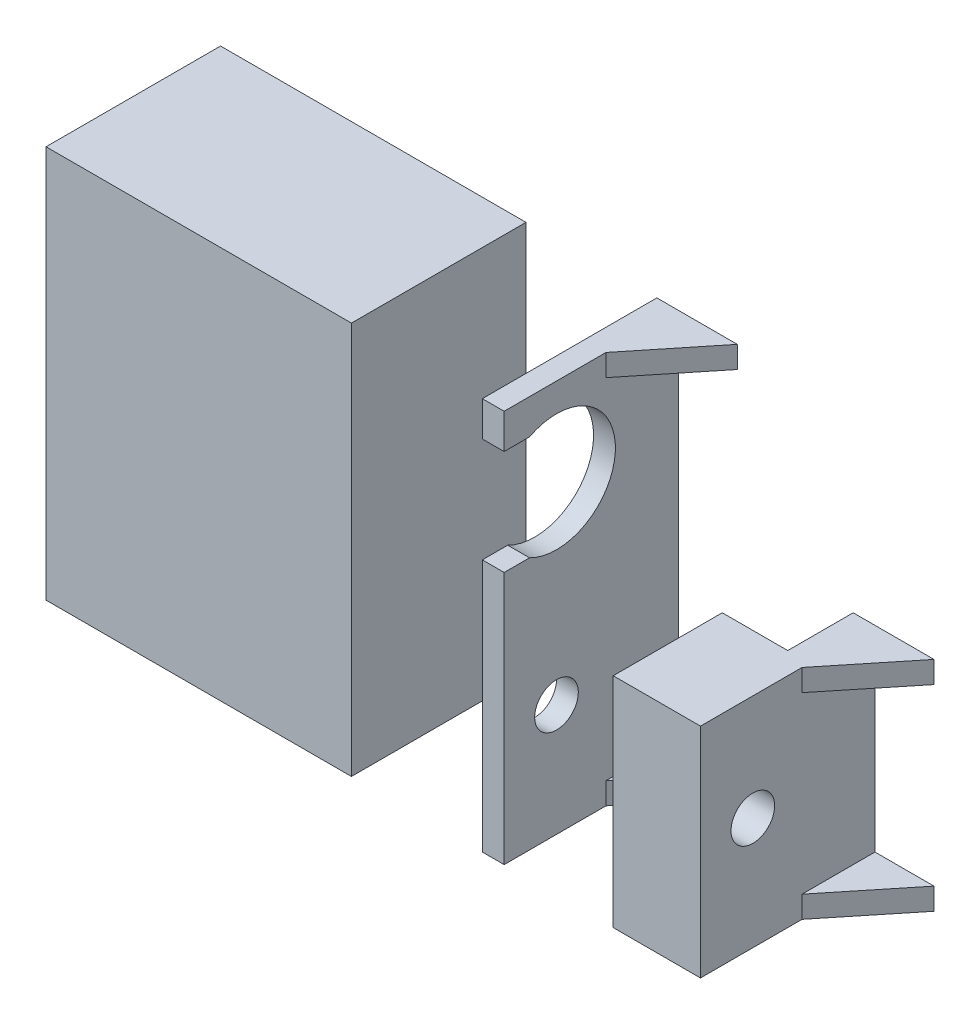
ISO-10303-21;
HEADER;
FILE_DESCRIPTION(('STEP AP214'),'2;1');
FILE_NAME('part.step','',(''),(''),'','','');
FILE_SCHEMA(('AUTOMOTIVE_DESIGN { 1 0 10303 214 1 1 1 1 }'));
ENDSEC;
DATA;
#1=APPLICATION_CONTEXT('core data for automotive mechanical design processes');
#2=APPLICATION_PROTOCOL_DEFINITION('international standard','automotive_design',2000,#1);
#3=PRODUCT_CONTEXT('',#1,'mechanical');
#4=PRODUCT('Part','Part','',(#3));
#5=PRODUCT_RELATED_PRODUCT_CATEGORY('part','',(#4));
#6=PRODUCT_DEFINITION_FORMATION('','',#4);
#7=PRODUCT_DEFINITION_CONTEXT('part definition',#1,'design');
#8=PRODUCT_DEFINITION('design','',#6,#7);
#9=PRODUCT_DEFINITION_SHAPE('','',#8);
#10=(LENGTH_UNIT() NAMED_UNIT(*) SI_UNIT(.MILLI.,.METRE.));
#11=(NAMED_UNIT(*) PLANE_ANGLE_UNIT() SI_UNIT($,.RADIAN.));
#12=(NAMED_UNIT(*) SI_UNIT($,.STERADIAN.) SOLID_ANGLE_UNIT());
#13=UNCERTAINTY_MEASURE_WITH_UNIT(LENGTH_MEASURE(1.E-05),#10,'distance_accuracy_value','');
#14=(GEOMETRIC_REPRESENTATION_CONTEXT(3) GLOBAL_UNCERTAINTY_ASSIGNED_CONTEXT((#13)) GLOBAL_UNIT_ASSIGNED_CONTEXT((#10,
#11,#12)) REPRESENTATION_CONTEXT('',''));
#15=CARTESIAN_POINT('',(0.,0.,0.));
#16=DIRECTION('',(0.,0.,1.));
#17=DIRECTION('',(1.,0.,0.));
#18=AXIS2_PLACEMENT_3D('',#15,#16,#17);
#19=CARTESIAN_POINT('',(-200.,20.,5.));
#20=DIRECTION('',(0.,0.,1.));
#21=DIRECTION('',(1.,0.,0.));
#22=AXIS2_PLACEMENT_3D('',#19,#20,#21);
#23=PLANE('',#22);
#24=DIRECTION('',(0.,-1.,0.));
#25=VECTOR('',#24,1.);
#26=CARTESIAN_POINT('',(-130.,20.,5.));
#27=LINE('',#26,#25);
#28=CARTESIAN_POINT('',(-130.,20.,5.));
#29=VERTEX_POINT('',#28);
#30=CARTESIAN_POINT('',(-130.,-70.,5.));
#31=VERTEX_POINT('',#30);
#32=EDGE_CURVE('E110',#29,#31,#27,.T.);
#33=ORIENTED_EDGE('',*,*,#32,.T.);
#34=DIRECTION('',(1.,0.,0.));
#35=VECTOR('',#34,1.);
#36=CARTESIAN_POINT('',(-200.,-70.,5.));
#37=LINE('',#36,#35);
#38=CARTESIAN_POINT('',(-200.,-70.,5.));
#39=VERTEX_POINT('',#38);
#40=EDGE_CURVE('E12',#39,#31,#37,.T.);
#41=ORIENTED_EDGE('',*,*,#40,.F.);
#42=DIRECTION('',(0.,-1.,0.));
#43=VECTOR('',#42,1.);
#44=CARTESIAN_POINT('',(-200.,20.,5.));
#45=LINE('',#44,#43);
#46=CARTESIAN_POINT('',(-200.,20.,5.));
#47=VERTEX_POINT('',#46);
#48=EDGE_CURVE('E98',#47,#39,#45,.T.);
#49=ORIENTED_EDGE('',*,*,#48,.F.);
#50=DIRECTION('',(1.,0.,0.));
#51=VECTOR('',#50,1.);
#52=CARTESIAN_POINT('',(-200.,20.,5.));
#53=LINE('',#52,#51);
#54=EDGE_CURVE('E106',#47,#29,#53,.T.);
#55=ORIENTED_EDGE('',*,*,#54,.T.);
#56=EDGE_LOOP('',(#33,#41,#49,#55));
#57=FACE_BOUND('',#56,.T.);
#58=ADVANCED_FACE('F47',(#57),#23,.F.);
#59=CARTESIAN_POINT('',(-200.,-70.,5.));
#60=DIRECTION('',(0.,1.,0.));
#61=DIRECTION('',(-1.,0.,0.));
#62=AXIS2_PLACEMENT_3D('',#59,#60,#61);
#63=PLANE('',#62);
#64=DIRECTION('',(0.,0.,1.));
#65=VECTOR('',#64,1.);
#66=CARTESIAN_POINT('',(-130.,-70.,5.));
#67=LINE('',#66,#65);
#68=CARTESIAN_POINT('',(-130.,-70.,45.));
#69=VERTEX_POINT('',#68);
#70=EDGE_CURVE('E102',#31,#69,#67,.T.);
#71=ORIENTED_EDGE('',*,*,#70,.T.);
#72=DIRECTION('',(1.,0.,0.));
#73=VECTOR('',#72,1.);
#74=CARTESIAN_POINT('',(-200.,-70.,45.));
#75=LINE('',#74,#73);
#76=CARTESIAN_POINT('',(-200.,-70.,45.));
#77=VERTEX_POINT('',#76);
#78=EDGE_CURVE('E55',#77,#69,#75,.T.);
#79=ORIENTED_EDGE('',*,*,#78,.F.);
#80=DIRECTION('',(0.,0.,1.));
#81=VECTOR('',#80,1.);
#82=CARTESIAN_POINT('',(-200.,-70.,5.));
#83=LINE('',#82,#81);
#84=EDGE_CURVE('E93',#39,#77,#83,.T.);
#85=ORIENTED_EDGE('',*,*,#84,.F.);
#86=ORIENTED_EDGE('',*,*,#40,.T.);
#87=EDGE_LOOP('',(#71,#79,#85,#86));
#88=FACE_BOUND('',#87,.T.);
#89=ADVANCED_FACE('F101',(#88),#63,.F.);
#90=CARTESIAN_POINT('',(-200.,20.,45.));
#91=DIRECTION('',(0.,0.,-1.));
#92=DIRECTION('',(0.,1.,0.));
#93=AXIS2_PLACEMENT_3D('',#90,#91,#92);
#94=PLANE('',#93);
#95=DIRECTION('',(0.,1.,0.));
#96=VECTOR('',#95,1.);
#97=CARTESIAN_POINT('',(-130.,20.,45.));
#98=LINE('',#97,#96);
#99=CARTESIAN_POINT('',(-130.,20.,45.));
#100=VERTEX_POINT('',#99);
#101=EDGE_CURVE('E80',#69,#100,#98,.T.);
#102=ORIENTED_EDGE('',*,*,#101,.T.);
#103=DIRECTION('',(1.,0.,0.));
#104=VECTOR('',#103,1.);
#105=CARTESIAN_POINT('',(-200.,20.,45.));
#106=LINE('',#105,#104);
#107=CARTESIAN_POINT('',(-200.,20.,45.));
#108=VERTEX_POINT('',#107);
#109=EDGE_CURVE('E103',#108,#100,#106,.T.);
#110=ORIENTED_EDGE('',*,*,#109,.F.);
#111=DIRECTION('',(0.,1.,0.));
#112=VECTOR('',#111,1.);
#113=CARTESIAN_POINT('',(-200.,20.,45.));
#114=LINE('',#113,#112);
#115=EDGE_CURVE('E96',#77,#108,#114,.T.);
#116=ORIENTED_EDGE('',*,*,#115,.F.);
#117=ORIENTED_EDGE('',*,*,#78,.T.);
#118=EDGE_LOOP('',(#102,#110,#116,#117));
#119=FACE_BOUND('',#118,.T.);
#120=ADVANCED_FACE('F104',(#119),#94,.F.);
#121=CARTESIAN_POINT('',(-200.,20.,5.));
#122=DIRECTION('',(0.,-1.,0.));
#123=DIRECTION('',(1.,0.,0.));
#124=AXIS2_PLACEMENT_3D('',#121,#122,#123);
#125=PLANE('',#124);
#126=DIRECTION('',(0.,0.,-1.));
#127=VECTOR('',#126,1.);
#128=CARTESIAN_POINT('',(-130.,20.,5.));
#129=LINE('',#128,#127);
#130=EDGE_CURVE('E86',#100,#29,#129,.T.);
#131=ORIENTED_EDGE('',*,*,#130,.T.);
#132=ORIENTED_EDGE('',*,*,#54,.F.);
#133=DIRECTION('',(0.,0.,-1.));
#134=VECTOR('',#133,1.);
#135=CARTESIAN_POINT('',(-200.,20.,5.));
#136=LINE('',#135,#134);
#137=EDGE_CURVE('E63',#108,#47,#136,.T.);
#138=ORIENTED_EDGE('',*,*,#137,.F.);
#139=ORIENTED_EDGE('',*,*,#109,.T.);
#140=EDGE_LOOP('',(#131,#132,#138,#139));
#141=FACE_BOUND('',#140,.T.);
#142=ADVANCED_FACE('F117',(#141),#125,.F.);
#143=CARTESIAN_POINT('',(-200.,0.,0.));
#144=DIRECTION('',(-1.,0.,0.));
#145=DIRECTION('',(0.,-1.,0.));
#146=AXIS2_PLACEMENT_3D('',#143,#144,#145);
#147=PLANE('',#146);
#148=ORIENTED_EDGE('',*,*,#48,.T.);
#149=ORIENTED_EDGE('',*,*,#84,.T.);
#150=ORIENTED_EDGE('',*,*,#115,.T.);
#151=ORIENTED_EDGE('',*,*,#137,.T.);
#152=EDGE_LOOP('',(#148,#149,#150,#151));
#153=FACE_BOUND('',#152,.T.);
#154=ADVANCED_FACE('F94',(#153),#147,.T.);
#155=CARTESIAN_POINT('',(-130.,0.,0.));
#156=DIRECTION('',(-1.,0.,0.));
#157=DIRECTION('',(0.,-1.,0.));
#158=AXIS2_PLACEMENT_3D('',#155,#156,#157);
#159=PLANE('',#158);
#160=ORIENTED_EDGE('',*,*,#32,.F.);
#161=ORIENTED_EDGE('',*,*,#130,.F.);
#162=ORIENTED_EDGE('',*,*,#101,.F.);
#163=ORIENTED_EDGE('',*,*,#70,.F.);
#164=EDGE_LOOP('',(#160,#161,#162,#163));
#165=FACE_BOUND('',#164,.T.);
#166=ADVANCED_FACE('F120',(#165),#159,.F.);
#167=CLOSED_SHELL('',(#58,#89,#120,#142,#154,#166));
#168=MANIFOLD_SOLID_BREP('B2',#167);
#169=CARTESIAN_POINT('',(-95.,20.,45.));
#170=DIRECTION('',(1.,0.,0.));
#171=DIRECTION('',(0.,0.,-1.));
#172=AXIS2_PLACEMENT_3D('',#169,#170,#171);
#173=PLANE('',#172);
#174=CARTESIAN_POINT('',(-95.,0.,33.));
#175=DIRECTION('',(1.,0.,0.));
#176=DIRECTION('',(0.,0.,-1.));
#177=AXIS2_PLACEMENT_3D('',#174,#175,#176);
#178=CIRCLE('',#177,13.5);
#179=CARTESIAN_POINT('',(-95.,-12.,39.1846584384265));
#180=VERTEX_POINT('',#179);
#181=CARTESIAN_POINT('',(-95.,12.,39.1846584384265));
#182=VERTEX_POINT('',#181);
#183=EDGE_CURVE('E283',#180,#182,#178,.T.);
#184=ORIENTED_EDGE('',*,*,#183,.F.);
#185=DIRECTION('',(0.,0.,-1.));
#186=VECTOR('',#185,1.);
#187=CARTESIAN_POINT('',(-95.,-12.,45.));
#188=LINE('',#187,#186);
#189=CARTESIAN_POINT('',(-95.,-12.,45.));
#190=VERTEX_POINT('',#189);
#191=EDGE_CURVE('E305',#190,#180,#188,.T.);
#192=ORIENTED_EDGE('',*,*,#191,.F.);
#193=DIRECTION('',(0.,-1.,0.));
#194=VECTOR('',#193,1.);
#195=CARTESIAN_POINT('',(-95.,-20.,45.));
#196=LINE('',#195,#194);
#197=CARTESIAN_POINT('',(-95.,-70.,45.));
#198=VERTEX_POINT('',#197);
#199=EDGE_CURVE('E390',#190,#198,#196,.T.);
#200=ORIENTED_EDGE('',*,*,#199,.T.);
#201=DIRECTION('',(0.,0.,-1.));
#202=VECTOR('',#201,1.);
#203=CARTESIAN_POINT('',(-95.,-70.,45.));
#204=LINE('',#203,#202);
#205=CARTESIAN_POINT('',(-95.,-70.,21.6603892199681));
#206=VERTEX_POINT('',#205);
#207=EDGE_CURVE('E271',#198,#206,#204,.T.);
#208=ORIENTED_EDGE('',*,*,#207,.T.);
#209=DIRECTION('',(0.,-1.,0.));
#210=VECTOR('',#209,1.);
#211=CARTESIAN_POINT('',(-95.,-65.,21.6603892199681));
#212=LINE('',#211,#210);
#213=CARTESIAN_POINT('',(-95.,-65.,21.6603892199681));
#214=VERTEX_POINT('',#213);
#215=EDGE_CURVE('E252',#214,#206,#212,.T.);
#216=ORIENTED_EDGE('',*,*,#215,.F.);
#217=DIRECTION('',(0.,0.,1.));
#218=VECTOR('',#217,1.);
#219=CARTESIAN_POINT('',(-95.,-65.,5.));
#220=LINE('',#219,#218);
#221=CARTESIAN_POINT('',(-95.,-65.,5.));
#222=VERTEX_POINT('',#221);
#223=EDGE_CURVE('E246',#222,#214,#220,.T.);
#224=ORIENTED_EDGE('',*,*,#223,.F.);
#225=DIRECTION('',(0.,-1.,0.));
#226=VECTOR('',#225,1.);
#227=CARTESIAN_POINT('',(-95.,20.,5.));
#228=LINE('',#227,#226);
#229=CARTESIAN_POINT('',(-95.,15.,5.));
#230=VERTEX_POINT('',#229);
#231=EDGE_CURVE('E189',#230,#222,#228,.T.);
#232=ORIENTED_EDGE('',*,*,#231,.F.);
#233=DIRECTION('',(0.,0.,-1.));
#234=VECTOR('',#233,1.);
#235=CARTESIAN_POINT('',(-95.,15.,21.6603892199681));
#236=LINE('',#235,#234);
#237=CARTESIAN_POINT('',(-95.,15.,21.6603892199681));
#238=VERTEX_POINT('',#237);
#239=EDGE_CURVE('E273',#238,#230,#236,.T.);
#240=ORIENTED_EDGE('',*,*,#239,.F.);
#241=DIRECTION('',(0.,1.,0.));
#242=VECTOR('',#241,1.);
#243=CARTESIAN_POINT('',(-95.,15.,21.6603892199681));
#244=LINE('',#243,#242);
#245=CARTESIAN_POINT('',(-95.,20.,21.6603892199681));
#246=VERTEX_POINT('',#245);
#247=EDGE_CURVE('E268',#238,#246,#244,.T.);
#248=ORIENTED_EDGE('',*,*,#247,.T.);
#249=DIRECTION('',(0.,0.,-1.));
#250=VECTOR('',#249,1.);
#251=CARTESIAN_POINT('',(-95.,20.,45.));
#252=LINE('',#251,#250);
#253=CARTESIAN_POINT('',(-95.,20.,45.));
#254=VERTEX_POINT('',#253);
#255=EDGE_CURVE('E371',#254,#246,#252,.T.);
#256=ORIENTED_EDGE('',*,*,#255,.F.);
#257=CARTESIAN_POINT('',(-95.,12.,45.));
#258=VERTEX_POINT('',#257);
#259=EDGE_CURVE('E270',#254,#258,#196,.T.);
#260=ORIENTED_EDGE('',*,*,#259,.T.);
#261=DIRECTION('',(0.,0.,1.));
#262=VECTOR('',#261,1.);
#263=CARTESIAN_POINT('',(-95.,12.,45.));
#264=LINE('',#263,#262);
#265=EDGE_CURVE('E281',#182,#258,#264,.T.);
#266=ORIENTED_EDGE('',*,*,#265,.F.);
#267=EDGE_LOOP('',(#184,#192,#200,#208,#216,#224,#232,#240,#248,#256,#260,#266));
#268=FACE_BOUND('',#267,.T.);
#269=CARTESIAN_POINT('',(-95.,-44.2798645583245,32.9999999999999));
#270=DIRECTION('',(1.,0.,0.));
#271=DIRECTION('',(0.,0.,-1.));
#272=AXIS2_PLACEMENT_3D('',#269,#270,#271);
#273=CIRCLE('',#272,5.);
#274=CARTESIAN_POINT('',(-95.,-44.2798645583245,27.9999999999999));
#275=VERTEX_POINT('',#274);
#276=EDGE_CURVE('E325',#275,#275,#273,.T.);
#277=ORIENTED_EDGE('',*,*,#276,.F.);
#278=EDGE_LOOP('',(#277));
#279=FACE_BOUND('',#278,.T.);
#280=ADVANCED_FACE('F179',(#268,#279),#173,.T.);
#281=CARTESIAN_POINT('',(0.,0.,45.));
#282=DIRECTION('',(0.,0.,1.));
#283=DIRECTION('',(1.,0.,0.));
#284=AXIS2_PLACEMENT_3D('',#281,#282,#283);
#285=PLANE('',#284);
#286=DIRECTION('',(1.,0.,0.));
#287=VECTOR('',#286,1.);
#288=CARTESIAN_POINT('',(-176.,12.,45.));
#289=LINE('',#288,#287);
#290=CARTESIAN_POINT('',(-100.,12.,45.));
#291=VERTEX_POINT('',#290);
#292=EDGE_CURVE('E326',#291,#258,#289,.T.);
#293=ORIENTED_EDGE('',*,*,#292,.T.);
#294=ORIENTED_EDGE('',*,*,#259,.F.);
#295=DIRECTION('',(1.,0.,0.));
#296=VECTOR('',#295,1.);
#297=CARTESIAN_POINT('',(-100.,20.,45.));
#298=LINE('',#297,#296);
#299=CARTESIAN_POINT('',(-100.,20.,45.));
#300=VERTEX_POINT('',#299);
#301=EDGE_CURVE('E376',#300,#254,#298,.T.);
#302=ORIENTED_EDGE('',*,*,#301,.F.);
#303=DIRECTION('',(0.,-1.,0.));
#304=VECTOR('',#303,1.);
#305=CARTESIAN_POINT('',(-100.,20.,45.));
#306=LINE('',#305,#304);
#307=EDGE_CURVE('E319',#300,#291,#306,.T.);
#308=ORIENTED_EDGE('',*,*,#307,.T.);
#309=EDGE_LOOP('',(#293,#294,#302,#308));
#310=FACE_BOUND('',#309,.T.);
#311=ADVANCED_FACE('F395',(#310),#285,.T.);
#312=CARTESIAN_POINT('',(-100.,-20.,45.));
#313=DIRECTION('',(1.,0.,0.));
#314=DIRECTION('',(0.,1.,0.));
#315=AXIS2_PLACEMENT_3D('',#312,#313,#314);
#316=PLANE('',#315);
#317=CARTESIAN_POINT('',(-100.,-44.2798645583245,32.9999999999999));
#318=DIRECTION('',(1.,0.,0.));
#319=DIRECTION('',(0.,1.,0.));
#320=AXIS2_PLACEMENT_3D('',#317,#318,#319);
#321=CIRCLE('',#320,5.);
#322=CARTESIAN_POINT('',(-100.,-39.2798645583245,32.9999999999999));
#323=VERTEX_POINT('',#322);
#324=EDGE_CURVE('E314',#323,#323,#321,.T.);
#325=ORIENTED_EDGE('',*,*,#324,.T.);
#326=EDGE_LOOP('',(#325));
#327=FACE_BOUND('',#326,.T.);
#328=DIRECTION('',(0.,0.,-1.));
#329=VECTOR('',#328,1.);
#330=CARTESIAN_POINT('',(-100.,-12.,45.));
#331=LINE('',#330,#329);
#332=CARTESIAN_POINT('',(-100.,-12.,45.));
#333=VERTEX_POINT('',#332);
#334=CARTESIAN_POINT('',(-100.,-12.,39.1846584384265));
#335=VERTEX_POINT('',#334);
#336=EDGE_CURVE('E302',#333,#335,#331,.T.);
#337=ORIENTED_EDGE('',*,*,#336,.T.);
#338=CARTESIAN_POINT('',(-100.,0.,33.));
#339=DIRECTION('',(-1.,0.,0.));
#340=DIRECTION('',(0.,-1.,0.));
#341=AXIS2_PLACEMENT_3D('',#338,#339,#340);
#342=CIRCLE('',#341,13.5);
#343=CARTESIAN_POINT('',(-100.,12.,39.1846584384265));
#344=VERTEX_POINT('',#343);
#345=EDGE_CURVE('E183',#344,#335,#342,.T.);
#346=ORIENTED_EDGE('',*,*,#345,.F.);
#347=DIRECTION('',(0.,0.,1.));
#348=VECTOR('',#347,1.);
#349=CARTESIAN_POINT('',(-100.,12.,45.));
#350=LINE('',#349,#348);
#351=EDGE_CURVE('E313',#344,#291,#350,.T.);
#352=ORIENTED_EDGE('',*,*,#351,.T.);
#353=ORIENTED_EDGE('',*,*,#307,.F.);
#354=DIRECTION('',(0.,0.,-1.));
#355=VECTOR('',#354,1.);
#356=CARTESIAN_POINT('',(-100.,20.,45.));
#357=LINE('',#356,#355);
#358=CARTESIAN_POINT('',(-100.,20.,5.));
#359=VERTEX_POINT('',#358);
#360=EDGE_CURVE('E316',#300,#359,#357,.T.);
#361=ORIENTED_EDGE('',*,*,#360,.T.);
#362=DIRECTION('',(0.,-1.,0.));
#363=VECTOR('',#362,1.);
#364=CARTESIAN_POINT('',(-100.,-20.,5.));
#365=LINE('',#364,#363);
#366=CARTESIAN_POINT('',(-100.,-70.,5.));
#367=VERTEX_POINT('',#366);
#368=EDGE_CURVE('E385',#359,#367,#365,.T.);
#369=ORIENTED_EDGE('',*,*,#368,.T.);
#370=DIRECTION('',(0.,0.,-1.));
#371=VECTOR('',#370,1.);
#372=CARTESIAN_POINT('',(-100.,-70.,45.));
#373=LINE('',#372,#371);
#374=CARTESIAN_POINT('',(-100.,-70.,45.));
#375=VERTEX_POINT('',#374);
#376=EDGE_CURVE('E379',#375,#367,#373,.T.);
#377=ORIENTED_EDGE('',*,*,#376,.F.);
#378=EDGE_CURVE('E312',#333,#375,#306,.T.);
#379=ORIENTED_EDGE('',*,*,#378,.F.);
#380=EDGE_LOOP('',(#337,#346,#352,#353,#361,#369,#377,#379));
#381=FACE_BOUND('',#380,.T.);
#382=ADVANCED_FACE('F309',(#327,#381),#316,.F.);
#383=CARTESIAN_POINT('',(-100.,-70.,45.));
#384=DIRECTION('',(0.,1.,0.));
#385=DIRECTION('',(0.,0.,1.));
#386=AXIS2_PLACEMENT_3D('',#383,#384,#385);
#387=PLANE('',#386);
#388=DIRECTION('',(1.,0.,0.));
#389=VECTOR('',#388,1.);
#390=CARTESIAN_POINT('',(-100.,-70.,5.));
#391=LINE('',#390,#389);
#392=CARTESIAN_POINT('',(-81.5668094011145,-70.,5.));
#393=VERTEX_POINT('',#392);
#394=EDGE_CURVE('E197',#367,#393,#391,.T.);
#395=ORIENTED_EDGE('',*,*,#394,.T.);
#396=DIRECTION('',(0.627678633147685,0.,-0.778472564378382));
#397=VECTOR('',#396,1.);
#398=CARTESIAN_POINT('',(-95.,-70.,21.6603892199681));
#399=LINE('',#398,#397);
#400=EDGE_CURVE('E265',#206,#393,#399,.T.);
#401=ORIENTED_EDGE('',*,*,#400,.F.);
#402=ORIENTED_EDGE('',*,*,#207,.F.);
#403=DIRECTION('',(1.,0.,0.));
#404=VECTOR('',#403,1.);
#405=CARTESIAN_POINT('',(-100.,-70.,45.));
#406=LINE('',#405,#404);
#407=EDGE_CURVE('E282',#375,#198,#406,.T.);
#408=ORIENTED_EDGE('',*,*,#407,.F.);
#409=ORIENTED_EDGE('',*,*,#376,.T.);
#410=EDGE_LOOP('',(#395,#401,#402,#408,#409));
#411=FACE_BOUND('',#410,.T.);
#412=ADVANCED_FACE('F338',(#411),#387,.F.);
#413=CARTESIAN_POINT('',(-100.,20.,45.));
#414=DIRECTION('',(0.,1.,0.));
#415=DIRECTION('',(0.,0.,1.));
#416=AXIS2_PLACEMENT_3D('',#413,#414,#415);
#417=PLANE('',#416);
#418=DIRECTION('',(1.,0.,0.));
#419=VECTOR('',#418,1.);
#420=CARTESIAN_POINT('',(-100.,20.,5.));
#421=LINE('',#420,#419);
#422=CARTESIAN_POINT('',(-81.5668094011145,20.,5.));
#423=VERTEX_POINT('',#422);
#424=EDGE_CURVE('E212',#359,#423,#421,.T.);
#425=ORIENTED_EDGE('',*,*,#424,.F.);
#426=ORIENTED_EDGE('',*,*,#360,.F.);
#427=ORIENTED_EDGE('',*,*,#301,.T.);
#428=ORIENTED_EDGE('',*,*,#255,.T.);
#429=DIRECTION('',(-0.627678633147685,0.,0.778472564378382));
#430=VECTOR('',#429,1.);
#431=CARTESIAN_POINT('',(-81.5668094011145,20.,5.));
#432=LINE('',#431,#430);
#433=EDGE_CURVE('E259',#423,#246,#432,.T.);
#434=ORIENTED_EDGE('',*,*,#433,.F.);
#435=EDGE_LOOP('',(#425,#426,#427,#428,#434));
#436=FACE_BOUND('',#435,.T.);
#437=ADVANCED_FACE('F374',(#436),#417,.T.);
#438=DIRECTION('',(1.,0.,0.));
#439=VECTOR('',#438,1.);
#440=CARTESIAN_POINT('',(-176.,-12.,45.));
#441=LINE('',#440,#439);
#442=EDGE_CURVE('E306',#333,#190,#441,.T.);
#443=ORIENTED_EDGE('',*,*,#442,.F.);
#444=ORIENTED_EDGE('',*,*,#378,.T.);
#445=ORIENTED_EDGE('',*,*,#407,.T.);
#446=ORIENTED_EDGE('',*,*,#199,.F.);
#447=EDGE_LOOP('',(#443,#444,#445,#446));
#448=FACE_BOUND('',#447,.T.);
#449=ADVANCED_FACE('F402',(#448),#285,.T.);
#450=CARTESIAN_POINT('',(-176.,12.,45.));
#451=DIRECTION('',(0.,1.,0.));
#452=DIRECTION('',(0.,0.,1.));
#453=AXIS2_PLACEMENT_3D('',#450,#451,#452);
#454=PLANE('',#453);
#455=ORIENTED_EDGE('',*,*,#351,.F.);
#456=DIRECTION('',(-1.,0.,0.));
#457=VECTOR('',#456,1.);
#458=CARTESIAN_POINT('',(-90.,12.,39.1846584384265));
#459=LINE('',#458,#457);
#460=EDGE_CURVE('E279',#344,#182,#459,.F.);
#461=ORIENTED_EDGE('',*,*,#460,.T.);
#462=ORIENTED_EDGE('',*,*,#265,.T.);
#463=ORIENTED_EDGE('',*,*,#292,.F.);
#464=EDGE_LOOP('',(#455,#461,#462,#463));
#465=FACE_BOUND('',#464,.T.);
#466=ADVANCED_FACE('F398',(#465),#454,.F.);
#467=CARTESIAN_POINT('',(-176.,-12.,45.));
#468=DIRECTION('',(0.,-1.,0.));
#469=DIRECTION('',(0.,0.,-1.));
#470=AXIS2_PLACEMENT_3D('',#467,#468,#469);
#471=PLANE('',#470);
#472=ORIENTED_EDGE('',*,*,#191,.T.);
#473=DIRECTION('',(-1.,0.,0.));
#474=VECTOR('',#473,1.);
#475=CARTESIAN_POINT('',(-90.,-12.,39.1846584384265));
#476=LINE('',#475,#474);
#477=EDGE_CURVE('E290',#180,#335,#476,.T.);
#478=ORIENTED_EDGE('',*,*,#477,.T.);
#479=ORIENTED_EDGE('',*,*,#336,.F.);
#480=ORIENTED_EDGE('',*,*,#442,.T.);
#481=EDGE_LOOP('',(#472,#478,#479,#480));
#482=FACE_BOUND('',#481,.T.);
#483=ADVANCED_FACE('F299',(#482),#471,.F.);
#484=CARTESIAN_POINT('',(-331.,-44.2798645583245,32.9999999999999));
#485=DIRECTION('',(1.,0.,0.));
#486=DIRECTION('',(0.,0.,-1.));
#487=AXIS2_PLACEMENT_3D('',#484,#485,#486);
#488=CYLINDRICAL_SURFACE('',#487,5.);
#489=ORIENTED_EDGE('',*,*,#276,.T.);
#490=EDGE_LOOP('',(#489));
#491=FACE_BOUND('',#490,.T.);
#492=ORIENTED_EDGE('',*,*,#324,.F.);
#493=EDGE_LOOP('',(#492));
#494=FACE_BOUND('',#493,.T.);
#495=ADVANCED_FACE('F426',(#491,#494),#488,.F.);
#496=CARTESIAN_POINT('',(-95.,-65.,21.6603892199681));
#497=DIRECTION('',(-0.778472564378382,0.,-0.627678633147685));
#498=DIRECTION('',(-0.627678633147685,0.,0.778472564378382));
#499=AXIS2_PLACEMENT_3D('',#496,#497,#498);
#500=PLANE('',#499);
#501=ORIENTED_EDGE('',*,*,#400,.T.);
#502=DIRECTION('',(0.,-1.,0.));
#503=VECTOR('',#502,1.);
#504=CARTESIAN_POINT('',(-81.5668094011145,-65.,5.));
#505=LINE('',#504,#503);
#506=CARTESIAN_POINT('',(-81.5668094011145,-65.,5.));
#507=VERTEX_POINT('',#506);
#508=EDGE_CURVE('E45',#507,#393,#505,.T.);
#509=ORIENTED_EDGE('',*,*,#508,.F.);
#510=DIRECTION('',(0.627678633147685,0.,-0.778472564378382));
#511=VECTOR('',#510,1.);
#512=CARTESIAN_POINT('',(-95.,-65.,21.6603892199681));
#513=LINE('',#512,#511);
#514=EDGE_CURVE('E255',#214,#507,#513,.T.);
#515=ORIENTED_EDGE('',*,*,#514,.F.);
#516=ORIENTED_EDGE('',*,*,#215,.T.);
#517=EDGE_LOOP('',(#501,#509,#515,#516));
#518=FACE_BOUND('',#517,.T.);
#519=ADVANCED_FACE('F335',(#518),#500,.F.);
#520=CARTESIAN_POINT('',(0.,-65.,0.));
#521=DIRECTION('',(0.,-1.,0.));
#522=DIRECTION('',(0.,0.,-1.));
#523=AXIS2_PLACEMENT_3D('',#520,#521,#522);
#524=PLANE('',#523);
#525=ORIENTED_EDGE('',*,*,#223,.T.);
#526=ORIENTED_EDGE('',*,*,#514,.T.);
#527=DIRECTION('',(-1.,0.,0.));
#528=VECTOR('',#527,1.);
#529=CARTESIAN_POINT('',(-81.5668094011145,-65.,5.));
#530=LINE('',#529,#528);
#531=EDGE_CURVE('E234',#507,#222,#530,.T.);
#532=ORIENTED_EDGE('',*,*,#531,.T.);
#533=EDGE_LOOP('',(#525,#526,#532));
#534=FACE_BOUND('',#533,.T.);
#535=ADVANCED_FACE('F257',(#534),#524,.F.);
#536=CARTESIAN_POINT('',(-81.5668094011145,15.,5.));
#537=DIRECTION('',(-0.778472564378382,0.,-0.627678633147685));
#538=DIRECTION('',(-0.627678633147685,0.,0.778472564378382));
#539=AXIS2_PLACEMENT_3D('',#536,#537,#538);
#540=PLANE('',#539);
#541=ORIENTED_EDGE('',*,*,#433,.T.);
#542=ORIENTED_EDGE('',*,*,#247,.F.);
#543=DIRECTION('',(-0.627678633147685,0.,0.778472564378382));
#544=VECTOR('',#543,1.);
#545=CARTESIAN_POINT('',(-81.5668094011145,15.,5.));
#546=LINE('',#545,#544);
#547=CARTESIAN_POINT('',(-81.5668094011145,15.,5.));
#548=VERTEX_POINT('',#547);
#549=EDGE_CURVE('E275',#548,#238,#546,.T.);
#550=ORIENTED_EDGE('',*,*,#549,.F.);
#551=DIRECTION('',(0.,1.,0.));
#552=VECTOR('',#551,1.);
#553=CARTESIAN_POINT('',(-81.5668094011145,15.,5.));
#554=LINE('',#553,#552);
#555=EDGE_CURVE('E217',#548,#423,#554,.T.);
#556=ORIENTED_EDGE('',*,*,#555,.T.);
#557=EDGE_LOOP('',(#541,#542,#550,#556));
#558=FACE_BOUND('',#557,.T.);
#559=ADVANCED_FACE('F367',(#558),#540,.F.);
#560=CARTESIAN_POINT('',(0.,15.,0.));
#561=DIRECTION('',(0.,1.,0.));
#562=DIRECTION('',(0.,0.,1.));
#563=AXIS2_PLACEMENT_3D('',#560,#561,#562);
#564=PLANE('',#563);
#565=DIRECTION('',(1.,0.,0.));
#566=VECTOR('',#565,1.);
#567=CARTESIAN_POINT('',(-95.,15.,5.));
#568=LINE('',#567,#566);
#569=EDGE_CURVE('E239',#230,#548,#568,.T.);
#570=ORIENTED_EDGE('',*,*,#569,.T.);
#571=ORIENTED_EDGE('',*,*,#549,.T.);
#572=ORIENTED_EDGE('',*,*,#239,.T.);
#573=EDGE_LOOP('',(#570,#571,#572));
#574=FACE_BOUND('',#573,.T.);
#575=ADVANCED_FACE('F366',(#574),#564,.F.);
#576=CARTESIAN_POINT('',(-90.,0.,33.));
#577=DIRECTION('',(-1.,0.,0.));
#578=DIRECTION('',(0.,-1.,0.));
#579=AXIS2_PLACEMENT_3D('',#576,#577,#578);
#580=CYLINDRICAL_SURFACE('',#579,13.5);
#581=ORIENTED_EDGE('',*,*,#345,.T.);
#582=ORIENTED_EDGE('',*,*,#477,.F.);
#583=ORIENTED_EDGE('',*,*,#183,.T.);
#584=ORIENTED_EDGE('',*,*,#460,.F.);
#585=EDGE_LOOP('',(#581,#582,#583,#584));
#586=FACE_BOUND('',#585,.T.);
#587=ADVANCED_FACE('F289',(#586),#580,.F.);
#588=CARTESIAN_POINT('',(0.,0.,5.));
#589=DIRECTION('',(0.,0.,1.));
#590=DIRECTION('',(1.,0.,0.));
#591=AXIS2_PLACEMENT_3D('',#588,#589,#590);
#592=PLANE('',#591);
#593=ORIENTED_EDGE('',*,*,#368,.F.);
#594=ORIENTED_EDGE('',*,*,#424,.T.);
#595=ORIENTED_EDGE('',*,*,#555,.F.);
#596=ORIENTED_EDGE('',*,*,#569,.F.);
#597=ORIENTED_EDGE('',*,*,#231,.T.);
#598=ORIENTED_EDGE('',*,*,#531,.F.);
#599=ORIENTED_EDGE('',*,*,#508,.T.);
#600=ORIENTED_EDGE('',*,*,#394,.F.);
#601=EDGE_LOOP('',(#593,#594,#595,#596,#597,#598,#599,#600));
#602=FACE_BOUND('',#601,.T.);
#603=ADVANCED_FACE('F181',(#602),#592,.F.);
#604=CLOSED_SHELL('',(#280,#311,#382,#412,#437,#449,#466,#483,#495,#519,#535,#559,#575,#587,#603));
#605=MANIFOLD_SOLID_BREP('B6',#604);
#606=CARTESIAN_POINT('',(181.,-44.2798645583245,32.9999999999999));
#607=DIRECTION('',(-1.,0.,0.));
#608=DIRECTION('',(0.,0.,1.));
#609=AXIS2_PLACEMENT_3D('',#606,#607,#608);
#610=CYLINDRICAL_SURFACE('',#609,5.);
#611=CARTESIAN_POINT('',(-50.,-44.2798645583245,32.9999999999999));
#612=DIRECTION('',(1.,0.,0.));
#613=DIRECTION('',(0.,1.,0.));
#614=AXIS2_PLACEMENT_3D('',#611,#612,#613);
#615=CIRCLE('',#614,5.);
#616=CARTESIAN_POINT('',(-50.,-39.2798645583245,32.9999999999999));
#617=VERTEX_POINT('',#616);
#618=EDGE_CURVE('E647',#617,#617,#615,.F.);
#619=ORIENTED_EDGE('',*,*,#618,.F.);
#620=EDGE_LOOP('',(#619));
#621=FACE_BOUND('',#620,.T.);
#622=CARTESIAN_POINT('',(-70.,-44.2798645583245,32.9999999999999));
#623=DIRECTION('',(1.,0.,0.));
#624=DIRECTION('',(0.,1.,0.));
#625=AXIS2_PLACEMENT_3D('',#622,#623,#624);
#626=CIRCLE('',#625,5.);
#627=CARTESIAN_POINT('',(-70.,-39.2798645583245,32.9999999999999));
#628=VERTEX_POINT('',#627);
#629=EDGE_CURVE('E724',#628,#628,#626,.F.);
#630=ORIENTED_EDGE('',*,*,#629,.T.);
#631=EDGE_LOOP('',(#630));
#632=FACE_BOUND('',#631,.T.);
#633=ADVANCED_FACE('F540',(#621,#632),#610,.F.);
#634=CARTESIAN_POINT('',(-150.,0.,45.));
#635=DIRECTION('',(0.,0.,1.));
#636=DIRECTION('',(-1.,0.,0.));
#637=AXIS2_PLACEMENT_3D('',#634,#635,#636);
#638=PLANE('',#637);
#639=DIRECTION('',(1.,0.,0.));
#640=VECTOR('',#639,1.);
#641=CARTESIAN_POINT('',(-150.,-20.,45.));
#642=LINE('',#641,#640);
#643=CARTESIAN_POINT('',(-70.,-20.,45.));
#644=VERTEX_POINT('',#643);
#645=CARTESIAN_POINT('',(-50.,-20.,45.));
#646=VERTEX_POINT('',#645);
#647=EDGE_CURVE('E177',#644,#646,#642,.T.);
#648=ORIENTED_EDGE('',*,*,#647,.F.);
#649=DIRECTION('',(0.,1.,0.));
#650=VECTOR('',#649,1.);
#651=CARTESIAN_POINT('',(-70.,-20.,45.));
#652=LINE('',#651,#650);
#653=CARTESIAN_POINT('',(-70.,-70.,45.));
#654=VERTEX_POINT('',#653);
#655=EDGE_CURVE('E679',#654,#644,#652,.T.);
#656=ORIENTED_EDGE('',*,*,#655,.F.);
#657=DIRECTION('',(-1.,0.,0.));
#658=VECTOR('',#657,1.);
#659=CARTESIAN_POINT('',(-50.,-70.,45.));
#660=LINE('',#659,#658);
#661=CARTESIAN_POINT('',(-50.,-70.,45.));
#662=VERTEX_POINT('',#661);
#663=EDGE_CURVE('E639',#662,#654,#660,.T.);
#664=ORIENTED_EDGE('',*,*,#663,.F.);
#665=DIRECTION('',(0.,-1.,0.));
#666=VECTOR('',#665,1.);
#667=CARTESIAN_POINT('',(-50.,20.,45.));
#668=LINE('',#667,#666);
#669=EDGE_CURVE('E636',#646,#662,#668,.T.);
#670=ORIENTED_EDGE('',*,*,#669,.F.);
#671=EDGE_LOOP('',(#648,#656,#664,#670));
#672=FACE_BOUND('',#671,.T.);
#673=ADVANCED_FACE('F685',(#672),#638,.T.);
#674=CARTESIAN_POINT('',(-70.,0.,0.));
#675=DIRECTION('',(1.,0.,0.));
#676=DIRECTION('',(0.,1.,0.));
#677=AXIS2_PLACEMENT_3D('',#674,#675,#676);
#678=PLANE('',#677);
#679=ORIENTED_EDGE('',*,*,#629,.F.);
#680=EDGE_LOOP('',(#679));
#681=FACE_BOUND('',#680,.T.);
#682=ORIENTED_EDGE('',*,*,#655,.T.);
#683=DIRECTION('',(0.,0.,-1.));
#684=VECTOR('',#683,1.);
#685=CARTESIAN_POINT('',(-70.,-20.,45.));
#686=LINE('',#685,#684);
#687=CARTESIAN_POINT('',(-70.,-20.,20.));
#688=VERTEX_POINT('',#687);
#689=EDGE_CURVE('E687',#644,#688,#686,.T.);
#690=ORIENTED_EDGE('',*,*,#689,.T.);
#691=DIRECTION('',(0.,-1.,0.));
#692=VECTOR('',#691,1.);
#693=CARTESIAN_POINT('',(-70.,-20.,20.));
#694=LINE('',#693,#692);
#695=CARTESIAN_POINT('',(-70.,-70.,20.));
#696=VERTEX_POINT('',#695);
#697=EDGE_CURVE('E681',#688,#696,#694,.T.);
#698=ORIENTED_EDGE('',*,*,#697,.T.);
#699=DIRECTION('',(0.,0.,1.));
#700=VECTOR('',#699,1.);
#701=CARTESIAN_POINT('',(-70.,-70.,45.));
#702=LINE('',#701,#700);
#703=EDGE_CURVE('E671',#696,#654,#702,.T.);
#704=ORIENTED_EDGE('',*,*,#703,.T.);
#705=EDGE_LOOP('',(#682,#690,#698,#704));
#706=FACE_BOUND('',#705,.T.);
#707=ADVANCED_FACE('F678',(#681,#706),#678,.F.);
#708=CARTESIAN_POINT('',(-70.,-20.,20.));
#709=DIRECTION('',(0.,0.,1.));
#710=DIRECTION('',(0.,-1.,0.));
#711=AXIS2_PLACEMENT_3D('',#708,#709,#710);
#712=PLANE('',#711);
#713=DIRECTION('',(0.,-1.,0.));
#714=VECTOR('',#713,1.);
#715=CARTESIAN_POINT('',(-55.,-20.,20.));
#716=LINE('',#715,#714);
#717=CARTESIAN_POINT('',(-55.,-20.,20.));
#718=VERTEX_POINT('',#717);
#719=CARTESIAN_POINT('',(-55.,-70.,20.));
#720=VERTEX_POINT('',#719);
#721=EDGE_CURVE('E688',#718,#720,#716,.T.);
#722=ORIENTED_EDGE('',*,*,#721,.T.);
#723=DIRECTION('',(1.,0.,0.));
#724=VECTOR('',#723,1.);
#725=CARTESIAN_POINT('',(-70.,-70.,20.));
#726=LINE('',#725,#724);
#727=EDGE_CURVE('E683',#696,#720,#726,.T.);
#728=ORIENTED_EDGE('',*,*,#727,.F.);
#729=ORIENTED_EDGE('',*,*,#697,.F.);
#730=DIRECTION('',(1.,0.,0.));
#731=VECTOR('',#730,1.);
#732=CARTESIAN_POINT('',(-70.,-20.,20.));
#733=LINE('',#732,#731);
#734=EDGE_CURVE('E698',#688,#718,#733,.T.);
#735=ORIENTED_EDGE('',*,*,#734,.T.);
#736=EDGE_LOOP('',(#722,#728,#729,#735));
#737=FACE_BOUND('',#736,.T.);
#738=ADVANCED_FACE('F707',(#737),#712,.F.);
#739=CARTESIAN_POINT('',(0.,-65.,0.));
#740=DIRECTION('',(0.,-1.,0.));
#741=DIRECTION('',(0.,0.,-1.));
#742=AXIS2_PLACEMENT_3D('',#739,#740,#741);
#743=PLANE('',#742);
#744=DIRECTION('',(0.,0.,-1.));
#745=VECTOR('',#744,1.);
#746=CARTESIAN_POINT('',(-50.,-65.,5.));
#747=LINE('',#746,#745);
#748=CARTESIAN_POINT('',(-50.,-65.,21.7179771632657));
#749=VERTEX_POINT('',#748);
#750=CARTESIAN_POINT('',(-50.,-65.,5.));
#751=VERTEX_POINT('',#750);
#752=EDGE_CURVE('E634',#749,#751,#747,.T.);
#753=ORIENTED_EDGE('',*,*,#752,.F.);
#754=DIRECTION('',(-0.628725031870798,0.,0.777627696458314));
#755=VECTOR('',#754,1.);
#756=CARTESIAN_POINT('',(-50.,-65.,21.7179771632657));
#757=LINE('',#756,#755);
#758=CARTESIAN_POINT('',(-36.4832351359634,-65.,5.));
#759=VERTEX_POINT('',#758);
#760=EDGE_CURVE('E720',#759,#749,#757,.T.);
#761=ORIENTED_EDGE('',*,*,#760,.F.);
#762=DIRECTION('',(1.,0.,0.));
#763=VECTOR('',#762,1.);
#764=CARTESIAN_POINT('',(-36.4832351359634,-65.,5.));
#765=LINE('',#764,#763);
#766=EDGE_CURVE('E716',#751,#759,#765,.T.);
#767=ORIENTED_EDGE('',*,*,#766,.F.);
#768=EDGE_LOOP('',(#753,#761,#767));
#769=FACE_BOUND('',#768,.T.);
#770=ADVANCED_FACE('F737',(#769),#743,.F.);
#771=CARTESIAN_POINT('',(-50.,-65.,21.7179771632657));
#772=DIRECTION('',(0.777627696458314,0.,0.628725031870798));
#773=DIRECTION('',(0.628725031870798,0.,-0.777627696458314));
#774=AXIS2_PLACEMENT_3D('',#771,#772,#773);
#775=PLANE('',#774);
#776=DIRECTION('',(-0.628725031870798,0.,0.777627696458314));
#777=VECTOR('',#776,1.);
#778=CARTESIAN_POINT('',(-50.,-70.,21.7179771632657));
#779=LINE('',#778,#777);
#780=CARTESIAN_POINT('',(-36.4832351359634,-70.,5.));
#781=VERTEX_POINT('',#780);
#782=CARTESIAN_POINT('',(-50.,-70.,21.7179771632657));
#783=VERTEX_POINT('',#782);
#784=EDGE_CURVE('E709',#781,#783,#779,.T.);
#785=ORIENTED_EDGE('',*,*,#784,.F.);
#786=DIRECTION('',(0.,-1.,0.));
#787=VECTOR('',#786,1.);
#788=CARTESIAN_POINT('',(-36.4832351359634,-65.,5.));
#789=LINE('',#788,#787);
#790=EDGE_CURVE('E693',#759,#781,#789,.T.);
#791=ORIENTED_EDGE('',*,*,#790,.F.);
#792=ORIENTED_EDGE('',*,*,#760,.T.);
#793=DIRECTION('',(0.,-1.,0.));
#794=VECTOR('',#793,1.);
#795=CARTESIAN_POINT('',(-50.,-65.,21.7179771632657));
#796=LINE('',#795,#794);
#797=EDGE_CURVE('E555',#749,#783,#796,.T.);
#798=ORIENTED_EDGE('',*,*,#797,.T.);
#799=EDGE_LOOP('',(#785,#791,#792,#798));
#800=FACE_BOUND('',#799,.T.);
#801=ADVANCED_FACE('F712',(#800),#775,.T.);
#802=CARTESIAN_POINT('',(-50.,-70.,45.));
#803=DIRECTION('',(0.,-1.,0.));
#804=DIRECTION('',(0.,0.,-1.));
#805=AXIS2_PLACEMENT_3D('',#802,#803,#804);
#806=PLANE('',#805);
#807=DIRECTION('',(-1.,0.,0.));
#808=VECTOR('',#807,1.);
#809=CARTESIAN_POINT('',(-50.,-70.,5.));
#810=LINE('',#809,#808);
#811=CARTESIAN_POINT('',(-55.,-70.,5.));
#812=VERTEX_POINT('',#811);
#813=EDGE_CURVE('E637',#781,#812,#810,.T.);
#814=ORIENTED_EDGE('',*,*,#813,.F.);
#815=ORIENTED_EDGE('',*,*,#784,.T.);
#816=DIRECTION('',(0.,0.,-1.));
#817=VECTOR('',#816,1.);
#818=CARTESIAN_POINT('',(-50.,-70.,45.));
#819=LINE('',#818,#817);
#820=EDGE_CURVE('E560',#662,#783,#819,.T.);
#821=ORIENTED_EDGE('',*,*,#820,.F.);
#822=ORIENTED_EDGE('',*,*,#663,.T.);
#823=ORIENTED_EDGE('',*,*,#703,.F.);
#824=ORIENTED_EDGE('',*,*,#727,.T.);
#825=DIRECTION('',(0.,0.,-1.));
#826=VECTOR('',#825,1.);
#827=CARTESIAN_POINT('',(-55.,-70.,45.));
#828=LINE('',#827,#826);
#829=EDGE_CURVE('E548',#720,#812,#828,.T.);
#830=ORIENTED_EDGE('',*,*,#829,.T.);
#831=EDGE_LOOP('',(#814,#815,#821,#822,#823,#824,#830));
#832=FACE_BOUND('',#831,.T.);
#833=ADVANCED_FACE('F669',(#832),#806,.T.);
#834=CARTESIAN_POINT('',(0.,-25.,0.));
#835=DIRECTION('',(0.,1.,0.));
#836=DIRECTION('',(0.,0.,-1.));
#837=AXIS2_PLACEMENT_3D('',#834,#835,#836);
#838=PLANE('',#837);
#839=DIRECTION('',(0.,0.,-1.));
#840=VECTOR('',#839,1.);
#841=CARTESIAN_POINT('',(-50.,-25.,5.));
#842=LINE('',#841,#840);
#843=CARTESIAN_POINT('',(-50.,-25.,21.7179771632657));
#844=VERTEX_POINT('',#843);
#845=CARTESIAN_POINT('',(-50.,-25.,5.));
#846=VERTEX_POINT('',#845);
#847=EDGE_CURVE('E627',#844,#846,#842,.T.);
#848=ORIENTED_EDGE('',*,*,#847,.T.);
#849=DIRECTION('',(1.,0.,0.));
#850=VECTOR('',#849,1.);
#851=CARTESIAN_POINT('',(-36.4832351359634,-25.,5.));
#852=LINE('',#851,#850);
#853=CARTESIAN_POINT('',(-36.4832351359634,-25.,5.));
#854=VERTEX_POINT('',#853);
#855=EDGE_CURVE('E614',#846,#854,#852,.T.);
#856=ORIENTED_EDGE('',*,*,#855,.T.);
#857=DIRECTION('',(-0.628725031870798,0.,0.777627696458314));
#858=VECTOR('',#857,1.);
#859=CARTESIAN_POINT('',(-50.,-25.,21.7179771632657));
#860=LINE('',#859,#858);
#861=EDGE_CURVE('E624',#854,#844,#860,.T.);
#862=ORIENTED_EDGE('',*,*,#861,.T.);
#863=EDGE_LOOP('',(#848,#856,#862));
#864=FACE_BOUND('',#863,.T.);
#865=ADVANCED_FACE('F628',(#864),#838,.F.);
#866=CARTESIAN_POINT('',(-50.,-25.,21.7179771632657));
#867=DIRECTION('',(-0.777627696458314,0.,-0.628725031870798));
#868=DIRECTION('',(-0.628725031870798,0.,0.777627696458314));
#869=AXIS2_PLACEMENT_3D('',#866,#867,#868);
#870=PLANE('',#869);
#871=DIRECTION('',(-0.628725031870798,0.,0.777627696458314));
#872=VECTOR('',#871,1.);
#873=CARTESIAN_POINT('',(-50.,-20.,21.7179771632657));
#874=LINE('',#873,#872);
#875=CARTESIAN_POINT('',(-36.4832351359634,-20.,5.));
#876=VERTEX_POINT('',#875);
#877=CARTESIAN_POINT('',(-50.,-20.,21.7179771632657));
#878=VERTEX_POINT('',#877);
#879=EDGE_CURVE('E631',#876,#878,#874,.T.);
#880=ORIENTED_EDGE('',*,*,#879,.T.);
#881=DIRECTION('',(0.,1.,0.));
#882=VECTOR('',#881,1.);
#883=CARTESIAN_POINT('',(-50.,-25.,21.7179771632657));
#884=LINE('',#883,#882);
#885=EDGE_CURVE('E623',#844,#878,#884,.T.);
#886=ORIENTED_EDGE('',*,*,#885,.F.);
#887=ORIENTED_EDGE('',*,*,#861,.F.);
#888=DIRECTION('',(0.,1.,0.));
#889=VECTOR('',#888,1.);
#890=CARTESIAN_POINT('',(-36.4832351359634,-25.,5.));
#891=LINE('',#890,#889);
#892=EDGE_CURVE('E620',#854,#876,#891,.T.);
#893=ORIENTED_EDGE('',*,*,#892,.T.);
#894=EDGE_LOOP('',(#880,#886,#887,#893));
#895=FACE_BOUND('',#894,.T.);
#896=ADVANCED_FACE('F754',(#895),#870,.F.);
#897=CARTESIAN_POINT('',(-45.,-20.,5.00000000000001));
#898=DIRECTION('',(0.,-1.,0.));
#899=DIRECTION('',(1.,0.,0.));
#900=AXIS2_PLACEMENT_3D('',#897,#898,#899);
#901=PLANE('',#900);
#902=DIRECTION('',(0.,0.,-1.));
#903=VECTOR('',#902,1.);
#904=CARTESIAN_POINT('',(-50.,-20.,45.));
#905=LINE('',#904,#903);
#906=EDGE_CURVE('E649',#646,#878,#905,.T.);
#907=ORIENTED_EDGE('',*,*,#906,.T.);
#908=ORIENTED_EDGE('',*,*,#879,.F.);
#909=DIRECTION('',(-1.,0.,0.));
#910=VECTOR('',#909,1.);
#911=CARTESIAN_POINT('',(-45.,-20.,5.00000000000001));
#912=LINE('',#911,#910);
#913=CARTESIAN_POINT('',(-55.,-20.,5.));
#914=VERTEX_POINT('',#913);
#915=EDGE_CURVE('E654',#876,#914,#912,.T.);
#916=ORIENTED_EDGE('',*,*,#915,.T.);
#917=DIRECTION('',(0.,0.,1.));
#918=VECTOR('',#917,1.);
#919=CARTESIAN_POINT('',(-55.,-20.,5.00000000000001));
#920=LINE('',#919,#918);
#921=EDGE_CURVE('E660',#914,#718,#920,.T.);
#922=ORIENTED_EDGE('',*,*,#921,.T.);
#923=ORIENTED_EDGE('',*,*,#734,.F.);
#924=ORIENTED_EDGE('',*,*,#689,.F.);
#925=ORIENTED_EDGE('',*,*,#647,.T.);
#926=EDGE_LOOP('',(#907,#908,#916,#922,#923,#924,#925));
#927=FACE_BOUND('',#926,.T.);
#928=ADVANCED_FACE('F702',(#927),#901,.F.);
#929=CARTESIAN_POINT('',(-55.,-20.,45.));
#930=DIRECTION('',(1.,0.,0.));
#931=DIRECTION('',(0.,1.,0.));
#932=AXIS2_PLACEMENT_3D('',#929,#930,#931);
#933=PLANE('',#932);
#934=ORIENTED_EDGE('',*,*,#721,.F.);
#935=ORIENTED_EDGE('',*,*,#921,.F.);
#936=DIRECTION('',(0.,-1.,0.));
#937=VECTOR('',#936,1.);
#938=CARTESIAN_POINT('',(-55.,-20.,5.));
#939=LINE('',#938,#937);
#940=EDGE_CURVE('E641',#914,#812,#939,.T.);
#941=ORIENTED_EDGE('',*,*,#940,.T.);
#942=ORIENTED_EDGE('',*,*,#829,.F.);
#943=EDGE_LOOP('',(#934,#935,#941,#942));
#944=FACE_BOUND('',#943,.T.);
#945=ADVANCED_FACE('F542',(#944),#933,.F.);
#946=CARTESIAN_POINT('',(-50.,-20.,45.));
#947=DIRECTION('',(1.,0.,0.));
#948=DIRECTION('',(0.,1.,0.));
#949=AXIS2_PLACEMENT_3D('',#946,#947,#948);
#950=PLANE('',#949);
#951=ORIENTED_EDGE('',*,*,#618,.T.);
#952=EDGE_LOOP('',(#951));
#953=FACE_BOUND('',#952,.T.);
#954=ORIENTED_EDGE('',*,*,#847,.F.);
#955=ORIENTED_EDGE('',*,*,#885,.T.);
#956=ORIENTED_EDGE('',*,*,#906,.F.);
#957=ORIENTED_EDGE('',*,*,#669,.T.);
#958=ORIENTED_EDGE('',*,*,#820,.T.);
#959=ORIENTED_EDGE('',*,*,#797,.F.);
#960=ORIENTED_EDGE('',*,*,#752,.T.);
#961=DIRECTION('',(0.,-1.,0.));
#962=VECTOR('',#961,1.);
#963=CARTESIAN_POINT('',(-50.,-20.,5.));
#964=LINE('',#963,#962);
#965=EDGE_CURVE('E618',#846,#751,#964,.T.);
#966=ORIENTED_EDGE('',*,*,#965,.F.);
#967=EDGE_LOOP('',(#954,#955,#956,#957,#958,#959,#960,#966));
#968=FACE_BOUND('',#967,.T.);
#969=ADVANCED_FACE('F633',(#953,#968),#950,.T.);
#970=CARTESIAN_POINT('',(0.,0.,5.));
#971=DIRECTION('',(0.,0.,1.));
#972=DIRECTION('',(1.,0.,0.));
#973=AXIS2_PLACEMENT_3D('',#970,#971,#972);
#974=PLANE('',#973);
#975=ORIENTED_EDGE('',*,*,#813,.T.);
#976=ORIENTED_EDGE('',*,*,#940,.F.);
#977=ORIENTED_EDGE('',*,*,#915,.F.);
#978=ORIENTED_EDGE('',*,*,#892,.F.);
#979=ORIENTED_EDGE('',*,*,#855,.F.);
#980=ORIENTED_EDGE('',*,*,#965,.T.);
#981=ORIENTED_EDGE('',*,*,#766,.T.);
#982=ORIENTED_EDGE('',*,*,#790,.T.);
#983=EDGE_LOOP('',(#975,#976,#977,#978,#979,#980,#981,#982));
#984=FACE_BOUND('',#983,.T.);
#985=ADVANCED_FACE('F616',(#984),#974,.F.);
#986=CLOSED_SHELL('',(#633,#673,#707,#738,#770,#801,#833,#865,#896,#928,#945,#969,#985));
#987=MANIFOLD_SOLID_BREP('B39',#986);
#988=ADVANCED_BREP_SHAPE_REPRESENTATION('',(#18,#168,#605,#987),#14);
#989=SHAPE_DEFINITION_REPRESENTATION(#9,#988);
ENDSEC;
END-ISO-10303-21;
